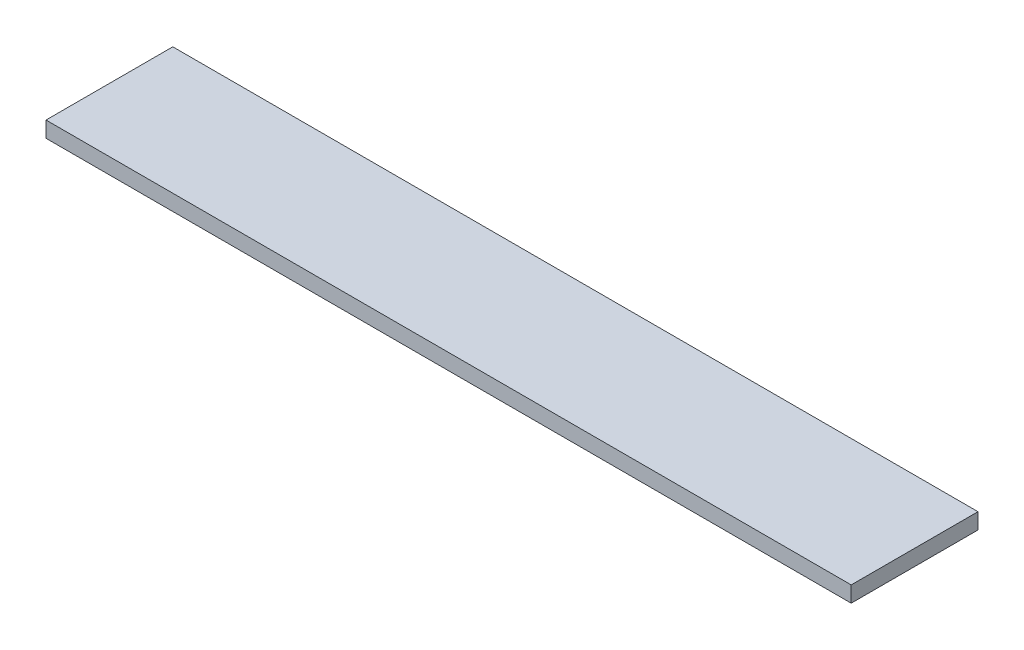
ISO-10303-21;
HEADER;
FILE_DESCRIPTION(('STEP AP214'),'2;1');
FILE_NAME('part.step','',(''),(''),'','','');
FILE_SCHEMA(('AUTOMOTIVE_DESIGN { 1 0 10303 214 1 1 1 1 }'));
ENDSEC;
DATA;
#1=APPLICATION_CONTEXT('core data for automotive mechanical design processes');
#2=APPLICATION_PROTOCOL_DEFINITION('international standard','automotive_design',2000,#1);
#3=PRODUCT_CONTEXT('',#1,'mechanical');
#4=PRODUCT('Part','Part','',(#3));
#5=PRODUCT_RELATED_PRODUCT_CATEGORY('part','',(#4));
#6=PRODUCT_DEFINITION_FORMATION('','',#4);
#7=PRODUCT_DEFINITION_CONTEXT('part definition',#1,'design');
#8=PRODUCT_DEFINITION('design','',#6,#7);
#9=PRODUCT_DEFINITION_SHAPE('','',#8);
#10=(LENGTH_UNIT() NAMED_UNIT(*) SI_UNIT(.MILLI.,.METRE.));
#11=(NAMED_UNIT(*) PLANE_ANGLE_UNIT() SI_UNIT($,.RADIAN.));
#12=(NAMED_UNIT(*) SI_UNIT($,.STERADIAN.) SOLID_ANGLE_UNIT());
#13=UNCERTAINTY_MEASURE_WITH_UNIT(LENGTH_MEASURE(1.E-05),#10,'distance_accuracy_value','');
#14=(GEOMETRIC_REPRESENTATION_CONTEXT(3) GLOBAL_UNCERTAINTY_ASSIGNED_CONTEXT((#13)) GLOBAL_UNIT_ASSIGNED_CONTEXT((#10,
#11,#12)) REPRESENTATION_CONTEXT('',''));
#15=CARTESIAN_POINT('',(0.,0.,0.));
#16=DIRECTION('',(0.,0.,1.));
#17=DIRECTION('',(1.,0.,0.));
#18=AXIS2_PLACEMENT_3D('',#15,#16,#17);
#19=CARTESIAN_POINT('',(-127.,5.,20.));
#20=DIRECTION('',(-1.,0.,0.));
#21=DIRECTION('',(0.,0.,1.));
#22=AXIS2_PLACEMENT_3D('',#19,#20,#21);
#23=PLANE('',#22);
#24=DIRECTION('',(0.,0.,-1.));
#25=VECTOR('',#24,1.);
#26=CARTESIAN_POINT('',(-127.,0.,20.));
#27=LINE('',#26,#25);
#28=CARTESIAN_POINT('',(-127.,0.,20.));
#29=VERTEX_POINT('',#28);
#30=CARTESIAN_POINT('',(-127.,0.,-20.));
#31=VERTEX_POINT('',#30);
#32=EDGE_CURVE('E99',#29,#31,#27,.T.);
#33=ORIENTED_EDGE('',*,*,#32,.F.);
#34=DIRECTION('',(0.,-1.,0.));
#35=VECTOR('',#34,1.);
#36=CARTESIAN_POINT('',(-127.,5.,20.));
#37=LINE('',#36,#35);
#38=CARTESIAN_POINT('',(-127.,5.,20.));
#39=VERTEX_POINT('',#38);
#40=EDGE_CURVE('E11',#39,#29,#37,.T.);
#41=ORIENTED_EDGE('',*,*,#40,.F.);
#42=DIRECTION('',(0.,0.,-1.));
#43=VECTOR('',#42,1.);
#44=CARTESIAN_POINT('',(-127.,5.,20.));
#45=LINE('',#44,#43);
#46=CARTESIAN_POINT('',(-127.,5.,-20.));
#47=VERTEX_POINT('',#46);
#48=EDGE_CURVE('E94',#39,#47,#45,.T.);
#49=ORIENTED_EDGE('',*,*,#48,.T.);
#50=DIRECTION('',(0.,-1.,0.));
#51=VECTOR('',#50,1.);
#52=CARTESIAN_POINT('',(-127.,5.,-20.));
#53=LINE('',#52,#51);
#54=EDGE_CURVE('E37',#47,#31,#53,.T.);
#55=ORIENTED_EDGE('',*,*,#54,.T.);
#56=EDGE_LOOP('',(#33,#41,#49,#55));
#57=FACE_BOUND('',#56,.T.);
#58=ADVANCED_FACE('F34',(#57),#23,.T.);
#59=CARTESIAN_POINT('',(-127.,5.,20.));
#60=DIRECTION('',(0.,0.,-1.));
#61=DIRECTION('',(-1.,0.,0.));
#62=AXIS2_PLACEMENT_3D('',#59,#60,#61);
#63=PLANE('',#62);
#64=DIRECTION('',(1.,0.,0.));
#65=VECTOR('',#64,1.);
#66=CARTESIAN_POINT('',(-127.,0.,20.));
#67=LINE('',#66,#65);
#68=CARTESIAN_POINT('',(127.,0.,20.));
#69=VERTEX_POINT('',#68);
#70=EDGE_CURVE('E67',#29,#69,#67,.T.);
#71=ORIENTED_EDGE('',*,*,#70,.T.);
#72=DIRECTION('',(0.,-1.,0.));
#73=VECTOR('',#72,1.);
#74=CARTESIAN_POINT('',(127.,5.,20.));
#75=LINE('',#74,#73);
#76=CARTESIAN_POINT('',(127.,5.,20.));
#77=VERTEX_POINT('',#76);
#78=EDGE_CURVE('E43',#77,#69,#75,.T.);
#79=ORIENTED_EDGE('',*,*,#78,.F.);
#80=DIRECTION('',(1.,0.,0.));
#81=VECTOR('',#80,1.);
#82=CARTESIAN_POINT('',(-127.,5.,20.));
#83=LINE('',#82,#81);
#84=EDGE_CURVE('E84',#39,#77,#83,.T.);
#85=ORIENTED_EDGE('',*,*,#84,.F.);
#86=ORIENTED_EDGE('',*,*,#40,.T.);
#87=EDGE_LOOP('',(#71,#79,#85,#86));
#88=FACE_BOUND('',#87,.T.);
#89=ADVANCED_FACE('F109',(#88),#63,.F.);
#90=CARTESIAN_POINT('',(127.,5.,20.));
#91=DIRECTION('',(-1.,0.,0.));
#92=DIRECTION('',(0.,0.,1.));
#93=AXIS2_PLACEMENT_3D('',#90,#91,#92);
#94=PLANE('',#93);
#95=DIRECTION('',(0.,0.,-1.));
#96=VECTOR('',#95,1.);
#97=CARTESIAN_POINT('',(127.,0.,20.));
#98=LINE('',#97,#96);
#99=CARTESIAN_POINT('',(127.,0.,-20.));
#100=VERTEX_POINT('',#99);
#101=EDGE_CURVE('E91',#69,#100,#98,.T.);
#102=ORIENTED_EDGE('',*,*,#101,.T.);
#103=DIRECTION('',(0.,-1.,0.));
#104=VECTOR('',#103,1.);
#105=CARTESIAN_POINT('',(127.,5.,-20.));
#106=LINE('',#105,#104);
#107=CARTESIAN_POINT('',(127.,5.,-20.));
#108=VERTEX_POINT('',#107);
#109=EDGE_CURVE('E88',#108,#100,#106,.T.);
#110=ORIENTED_EDGE('',*,*,#109,.F.);
#111=DIRECTION('',(0.,0.,-1.));
#112=VECTOR('',#111,1.);
#113=CARTESIAN_POINT('',(127.,5.,20.));
#114=LINE('',#113,#112);
#115=EDGE_CURVE('E79',#77,#108,#114,.T.);
#116=ORIENTED_EDGE('',*,*,#115,.F.);
#117=ORIENTED_EDGE('',*,*,#78,.T.);
#118=EDGE_LOOP('',(#102,#110,#116,#117));
#119=FACE_BOUND('',#118,.T.);
#120=ADVANCED_FACE('F89',(#119),#94,.F.);
#121=CARTESIAN_POINT('',(-127.,5.,-20.));
#122=DIRECTION('',(0.,0.,-1.));
#123=DIRECTION('',(-1.,0.,0.));
#124=AXIS2_PLACEMENT_3D('',#121,#122,#123);
#125=PLANE('',#124);
#126=DIRECTION('',(1.,0.,0.));
#127=VECTOR('',#126,1.);
#128=CARTESIAN_POINT('',(-127.,0.,-20.));
#129=LINE('',#128,#127);
#130=EDGE_CURVE('E102',#31,#100,#129,.T.);
#131=ORIENTED_EDGE('',*,*,#130,.F.);
#132=ORIENTED_EDGE('',*,*,#54,.F.);
#133=DIRECTION('',(1.,0.,0.));
#134=VECTOR('',#133,1.);
#135=CARTESIAN_POINT('',(-127.,5.,-20.));
#136=LINE('',#135,#134);
#137=EDGE_CURVE('E83',#47,#108,#136,.T.);
#138=ORIENTED_EDGE('',*,*,#137,.T.);
#139=ORIENTED_EDGE('',*,*,#109,.T.);
#140=EDGE_LOOP('',(#131,#132,#138,#139));
#141=FACE_BOUND('',#140,.T.);
#142=ADVANCED_FACE('F93',(#141),#125,.T.);
#143=CARTESIAN_POINT('',(0.,5.,0.));
#144=DIRECTION('',(0.,-1.,0.));
#145=DIRECTION('',(0.,0.,-1.));
#146=AXIS2_PLACEMENT_3D('',#143,#144,#145);
#147=PLANE('',#146);
#148=ORIENTED_EDGE('',*,*,#48,.F.);
#149=ORIENTED_EDGE('',*,*,#84,.T.);
#150=ORIENTED_EDGE('',*,*,#115,.T.);
#151=ORIENTED_EDGE('',*,*,#137,.F.);
#152=EDGE_LOOP('',(#148,#149,#150,#151));
#153=FACE_BOUND('',#152,.T.);
#154=ADVANCED_FACE('F82',(#153),#147,.F.);
#155=CARTESIAN_POINT('',(0.,0.,0.));
#156=DIRECTION('',(0.,-1.,0.));
#157=DIRECTION('',(0.,0.,-1.));
#158=AXIS2_PLACEMENT_3D('',#155,#156,#157);
#159=PLANE('',#158);
#160=ORIENTED_EDGE('',*,*,#32,.T.);
#161=ORIENTED_EDGE('',*,*,#130,.T.);
#162=ORIENTED_EDGE('',*,*,#101,.F.);
#163=ORIENTED_EDGE('',*,*,#70,.F.);
#164=EDGE_LOOP('',(#160,#161,#162,#163));
#165=FACE_BOUND('',#164,.T.);
#166=ADVANCED_FACE('F107',(#165),#159,.T.);
#167=CLOSED_SHELL('',(#58,#89,#120,#142,#154,#166));
#168=MANIFOLD_SOLID_BREP('B2',#167);
#169=ADVANCED_BREP_SHAPE_REPRESENTATION('',(#18,#168),#14);
#170=SHAPE_DEFINITION_REPRESENTATION(#9,#169);
ENDSEC;
END-ISO-10303-21;
